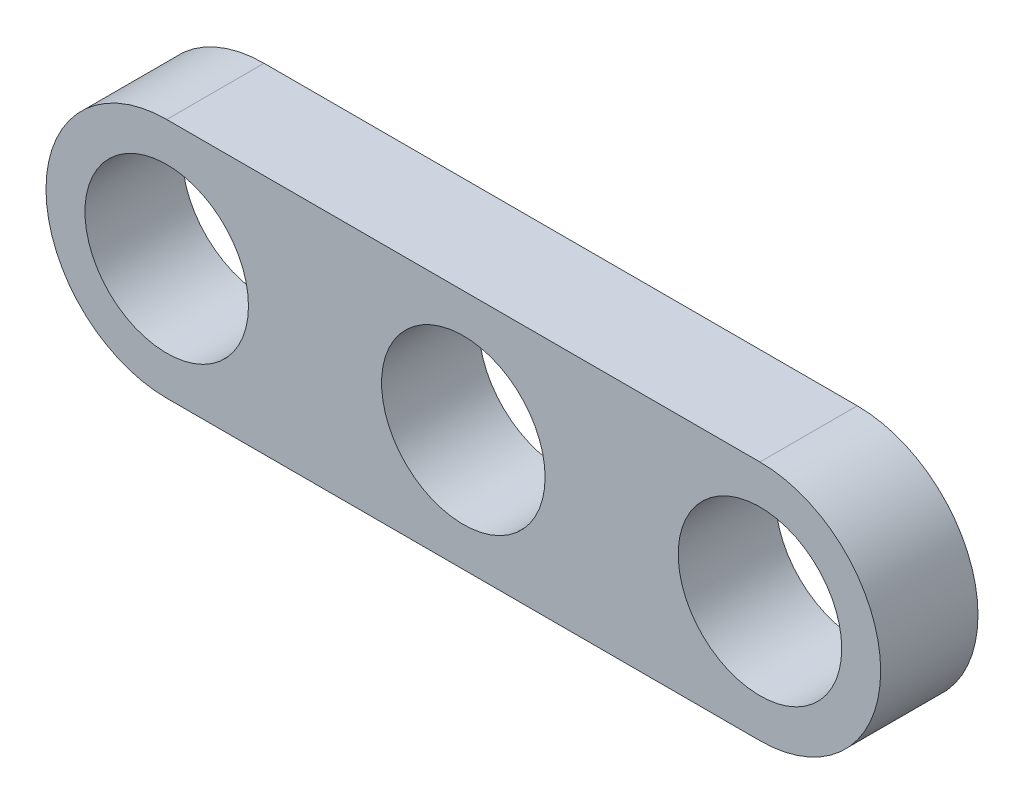
ISO-10303-21;
HEADER;
FILE_DESCRIPTION(('STEP AP214'),'2;1');
FILE_NAME('part.step','',(''),(''),'','','');
FILE_SCHEMA(('AUTOMOTIVE_DESIGN { 1 0 10303 214 1 1 1 1 }'));
ENDSEC;
DATA;
#1=APPLICATION_CONTEXT('core data for automotive mechanical design processes');
#2=APPLICATION_PROTOCOL_DEFINITION('international standard','automotive_design',2000,#1);
#3=PRODUCT_CONTEXT('',#1,'mechanical');
#4=PRODUCT('Part','Part','',(#3));
#5=PRODUCT_RELATED_PRODUCT_CATEGORY('part','',(#4));
#6=PRODUCT_DEFINITION_FORMATION('','',#4);
#7=PRODUCT_DEFINITION_CONTEXT('part definition',#1,'design');
#8=PRODUCT_DEFINITION('design','',#6,#7);
#9=PRODUCT_DEFINITION_SHAPE('','',#8);
#10=(LENGTH_UNIT() NAMED_UNIT(*) SI_UNIT(.MILLI.,.METRE.));
#11=(NAMED_UNIT(*) PLANE_ANGLE_UNIT() SI_UNIT($,.RADIAN.));
#12=(NAMED_UNIT(*) SI_UNIT($,.STERADIAN.) SOLID_ANGLE_UNIT());
#13=UNCERTAINTY_MEASURE_WITH_UNIT(LENGTH_MEASURE(1.E-05),#10,'distance_accuracy_value','');
#14=(GEOMETRIC_REPRESENTATION_CONTEXT(3) GLOBAL_UNCERTAINTY_ASSIGNED_CONTEXT((#13)) GLOBAL_UNIT_ASSIGNED_CONTEXT((#10,
#11,#12)) REPRESENTATION_CONTEXT('',''));
#15=CARTESIAN_POINT('',(0.,0.,0.));
#16=DIRECTION('',(0.,0.,1.));
#17=DIRECTION('',(1.,0.,0.));
#18=AXIS2_PLACEMENT_3D('',#15,#16,#17);
#19=CARTESIAN_POINT('',(-15.2370411810535,0.,5.));
#20=DIRECTION('',(0.,0.,1.));
#21=DIRECTION('',(1.,0.,0.));
#22=AXIS2_PLACEMENT_3D('',#19,#20,#21);
#23=PLANE('',#22);
#24=CARTESIAN_POINT('',(0.,0.,5.));
#25=DIRECTION('',(0.,0.,1.));
#26=DIRECTION('',(1.,0.,0.));
#27=AXIS2_PLACEMENT_3D('',#24,#25,#26);
#28=CIRCLE('',#27,4.20000000000003);
#29=CARTESIAN_POINT('',(4.20000000000002,0.,5.));
#30=VERTEX_POINT('',#29);
#31=EDGE_CURVE('E121',#30,#30,#28,.T.);
#32=ORIENTED_EDGE('',*,*,#31,.F.);
#33=EDGE_LOOP('',(#32));
#34=FACE_BOUND('',#33,.T.);
#35=CARTESIAN_POINT('',(-15.2370411810535,0.,5.));
#36=DIRECTION('',(0.,0.,1.));
#37=DIRECTION('',(1.,0.,0.));
#38=AXIS2_PLACEMENT_3D('',#35,#36,#37);
#39=CIRCLE('',#38,6.20000000000003);
#40=CARTESIAN_POINT('',(-15.2370411810535,6.20000000000003,5.));
#41=VERTEX_POINT('',#40);
#42=CARTESIAN_POINT('',(-15.2370411810535,-6.20000000000004,5.));
#43=VERTEX_POINT('',#42);
#44=EDGE_CURVE('E91',#41,#43,#39,.T.);
#45=ORIENTED_EDGE('',*,*,#44,.T.);
#46=DIRECTION('',(1.,0.,0.));
#47=VECTOR('',#46,1.);
#48=CARTESIAN_POINT('',(-15.2370411810535,-6.20000000000004,5.));
#49=LINE('',#48,#47);
#50=CARTESIAN_POINT('',(15.2370411810535,-6.20000000000002,5.));
#51=VERTEX_POINT('',#50);
#52=EDGE_CURVE('E86',#43,#51,#49,.T.);
#53=ORIENTED_EDGE('',*,*,#52,.T.);
#54=CARTESIAN_POINT('',(15.2370411810535,0.,5.));
#55=DIRECTION('',(0.,0.,1.));
#56=DIRECTION('',(1.,0.,0.));
#57=AXIS2_PLACEMENT_3D('',#54,#55,#56);
#58=CIRCLE('',#57,6.20000000000003);
#59=CARTESIAN_POINT('',(15.2370411810535,6.20000000000003,5.));
#60=VERTEX_POINT('',#59);
#61=EDGE_CURVE('E89',#51,#60,#58,.T.);
#62=ORIENTED_EDGE('',*,*,#61,.T.);
#63=DIRECTION('',(-1.,0.,0.));
#64=VECTOR('',#63,1.);
#65=CARTESIAN_POINT('',(-15.2370411810535,6.20000000000003,5.));
#66=LINE('',#65,#64);
#67=EDGE_CURVE('E56',#60,#41,#66,.T.);
#68=ORIENTED_EDGE('',*,*,#67,.T.);
#69=EDGE_LOOP('',(#45,#53,#62,#68));
#70=FACE_BOUND('',#69,.T.);
#71=CARTESIAN_POINT('',(-15.2370411810535,0.,5.));
#72=DIRECTION('',(0.,0.,1.));
#73=DIRECTION('',(1.,0.,0.));
#74=AXIS2_PLACEMENT_3D('',#71,#72,#73);
#75=CIRCLE('',#74,4.20000000000003);
#76=CARTESIAN_POINT('',(-11.0370411810535,0.,5.));
#77=VERTEX_POINT('',#76);
#78=EDGE_CURVE('E106',#77,#77,#75,.T.);
#79=ORIENTED_EDGE('',*,*,#78,.F.);
#80=EDGE_LOOP('',(#79));
#81=FACE_BOUND('',#80,.T.);
#82=CARTESIAN_POINT('',(15.2370411810535,0.,5.));
#83=DIRECTION('',(0.,0.,1.));
#84=DIRECTION('',(1.,0.,0.));
#85=AXIS2_PLACEMENT_3D('',#82,#83,#84);
#86=CIRCLE('',#85,4.20000000000002);
#87=CARTESIAN_POINT('',(19.4370411810535,0.,5.));
#88=VERTEX_POINT('',#87);
#89=EDGE_CURVE('E127',#88,#88,#86,.T.);
#90=ORIENTED_EDGE('',*,*,#89,.F.);
#91=EDGE_LOOP('',(#90));
#92=FACE_BOUND('',#91,.T.);
#93=ADVANCED_FACE('F39',(#34,#70,#81,#92),#23,.T.);
#94=CARTESIAN_POINT('',(-15.2370411810535,0.,0.));
#95=DIRECTION('',(0.,0.,1.));
#96=DIRECTION('',(1.,0.,0.));
#97=AXIS2_PLACEMENT_3D('',#94,#95,#96);
#98=PLANE('',#97);
#99=CARTESIAN_POINT('',(-15.2370411810535,0.,0.));
#100=DIRECTION('',(0.,0.,1.));
#101=DIRECTION('',(1.,0.,0.));
#102=AXIS2_PLACEMENT_3D('',#99,#100,#101);
#103=CIRCLE('',#102,6.20000000000003);
#104=CARTESIAN_POINT('',(-15.2370411810535,6.20000000000003,0.));
#105=VERTEX_POINT('',#104);
#106=CARTESIAN_POINT('',(-15.2370411810535,-6.20000000000004,0.));
#107=VERTEX_POINT('',#106);
#108=EDGE_CURVE('E103',#105,#107,#103,.T.);
#109=ORIENTED_EDGE('',*,*,#108,.F.);
#110=DIRECTION('',(-1.,0.,0.));
#111=VECTOR('',#110,1.);
#112=CARTESIAN_POINT('',(-15.2370411810535,6.20000000000003,0.));
#113=LINE('',#112,#111);
#114=CARTESIAN_POINT('',(15.2370411810535,6.20000000000003,0.));
#115=VERTEX_POINT('',#114);
#116=EDGE_CURVE('E79',#115,#105,#113,.T.);
#117=ORIENTED_EDGE('',*,*,#116,.F.);
#118=CARTESIAN_POINT('',(15.2370411810535,0.,0.));
#119=DIRECTION('',(0.,0.,1.));
#120=DIRECTION('',(1.,0.,0.));
#121=AXIS2_PLACEMENT_3D('',#118,#119,#120);
#122=CIRCLE('',#121,6.20000000000003);
#123=CARTESIAN_POINT('',(15.2370411810535,-6.20000000000002,0.));
#124=VERTEX_POINT('',#123);
#125=EDGE_CURVE('E73',#124,#115,#122,.T.);
#126=ORIENTED_EDGE('',*,*,#125,.F.);
#127=DIRECTION('',(1.,0.,0.));
#128=VECTOR('',#127,1.);
#129=CARTESIAN_POINT('',(-15.2370411810535,-6.20000000000004,0.));
#130=LINE('',#129,#128);
#131=EDGE_CURVE('E95',#107,#124,#130,.T.);
#132=ORIENTED_EDGE('',*,*,#131,.F.);
#133=EDGE_LOOP('',(#109,#117,#126,#132));
#134=FACE_BOUND('',#133,.T.);
#135=CARTESIAN_POINT('',(-15.2370411810535,0.,0.));
#136=DIRECTION('',(0.,0.,1.));
#137=DIRECTION('',(1.,0.,0.));
#138=AXIS2_PLACEMENT_3D('',#135,#136,#137);
#139=CIRCLE('',#138,4.20000000000003);
#140=CARTESIAN_POINT('',(-11.0370411810535,0.,0.));
#141=VERTEX_POINT('',#140);
#142=EDGE_CURVE('E118',#141,#141,#139,.T.);
#143=ORIENTED_EDGE('',*,*,#142,.T.);
#144=EDGE_LOOP('',(#143));
#145=FACE_BOUND('',#144,.T.);
#146=CARTESIAN_POINT('',(0.,0.,0.));
#147=DIRECTION('',(0.,0.,1.));
#148=DIRECTION('',(1.,0.,0.));
#149=AXIS2_PLACEMENT_3D('',#146,#147,#148);
#150=CIRCLE('',#149,4.20000000000003);
#151=CARTESIAN_POINT('',(4.20000000000002,0.,0.));
#152=VERTEX_POINT('',#151);
#153=EDGE_CURVE('E124',#152,#152,#150,.T.);
#154=ORIENTED_EDGE('',*,*,#153,.T.);
#155=EDGE_LOOP('',(#154));
#156=FACE_BOUND('',#155,.T.);
#157=CARTESIAN_POINT('',(15.2370411810535,0.,0.));
#158=DIRECTION('',(0.,0.,1.));
#159=DIRECTION('',(1.,0.,0.));
#160=AXIS2_PLACEMENT_3D('',#157,#158,#159);
#161=CIRCLE('',#160,4.20000000000002);
#162=CARTESIAN_POINT('',(19.4370411810535,0.,0.));
#163=VERTEX_POINT('',#162);
#164=EDGE_CURVE('E130',#163,#163,#161,.T.);
#165=ORIENTED_EDGE('',*,*,#164,.T.);
#166=EDGE_LOOP('',(#165));
#167=FACE_BOUND('',#166,.T.);
#168=ADVANCED_FACE('F114',(#134,#145,#156,#167),#98,.F.);
#169=CARTESIAN_POINT('',(-15.2370411810535,0.,5.));
#170=DIRECTION('',(0.,0.,-1.));
#171=DIRECTION('',(-1.,0.,0.));
#172=AXIS2_PLACEMENT_3D('',#169,#170,#171);
#173=CYLINDRICAL_SURFACE('',#172,6.20000000000003);
#174=ORIENTED_EDGE('',*,*,#108,.T.);
#175=DIRECTION('',(0.,0.,-1.));
#176=VECTOR('',#175,1.);
#177=CARTESIAN_POINT('',(-15.2370411810535,-6.20000000000004,5.));
#178=LINE('',#177,#176);
#179=EDGE_CURVE('E11',#43,#107,#178,.T.);
#180=ORIENTED_EDGE('',*,*,#179,.F.);
#181=ORIENTED_EDGE('',*,*,#44,.F.);
#182=DIRECTION('',(0.,0.,-1.));
#183=VECTOR('',#182,1.);
#184=CARTESIAN_POINT('',(-15.2370411810535,6.20000000000003,5.));
#185=LINE('',#184,#183);
#186=EDGE_CURVE('E99',#41,#105,#185,.T.);
#187=ORIENTED_EDGE('',*,*,#186,.T.);
#188=EDGE_LOOP('',(#174,#180,#181,#187));
#189=FACE_BOUND('',#188,.T.);
#190=ADVANCED_FACE('F41',(#189),#173,.T.);
#191=CARTESIAN_POINT('',(-15.2370411810535,-6.20000000000004,5.));
#192=DIRECTION('',(0.,1.,0.));
#193=DIRECTION('',(-1.,0.,0.));
#194=AXIS2_PLACEMENT_3D('',#191,#192,#193);
#195=PLANE('',#194);
#196=ORIENTED_EDGE('',*,*,#131,.T.);
#197=DIRECTION('',(0.,0.,-1.));
#198=VECTOR('',#197,1.);
#199=CARTESIAN_POINT('',(15.2370411810535,-6.20000000000002,5.));
#200=LINE('',#199,#198);
#201=EDGE_CURVE('E48',#51,#124,#200,.T.);
#202=ORIENTED_EDGE('',*,*,#201,.F.);
#203=ORIENTED_EDGE('',*,*,#52,.F.);
#204=ORIENTED_EDGE('',*,*,#179,.T.);
#205=EDGE_LOOP('',(#196,#202,#203,#204));
#206=FACE_BOUND('',#205,.T.);
#207=ADVANCED_FACE('F94',(#206),#195,.F.);
#208=CARTESIAN_POINT('',(15.2370411810535,0.,5.));
#209=DIRECTION('',(0.,0.,-1.));
#210=DIRECTION('',(-1.,0.,0.));
#211=AXIS2_PLACEMENT_3D('',#208,#209,#210);
#212=CYLINDRICAL_SURFACE('',#211,6.20000000000003);
#213=ORIENTED_EDGE('',*,*,#125,.T.);
#214=DIRECTION('',(0.,0.,-1.));
#215=VECTOR('',#214,1.);
#216=CARTESIAN_POINT('',(15.2370411810535,6.20000000000003,5.));
#217=LINE('',#216,#215);
#218=EDGE_CURVE('E96',#60,#115,#217,.T.);
#219=ORIENTED_EDGE('',*,*,#218,.F.);
#220=ORIENTED_EDGE('',*,*,#61,.F.);
#221=ORIENTED_EDGE('',*,*,#201,.T.);
#222=EDGE_LOOP('',(#213,#219,#220,#221));
#223=FACE_BOUND('',#222,.T.);
#224=ADVANCED_FACE('F97',(#223),#212,.T.);
#225=CARTESIAN_POINT('',(-15.2370411810535,6.20000000000003,5.));
#226=DIRECTION('',(0.,-1.,0.));
#227=DIRECTION('',(1.,0.,0.));
#228=AXIS2_PLACEMENT_3D('',#225,#226,#227);
#229=PLANE('',#228);
#230=ORIENTED_EDGE('',*,*,#116,.T.);
#231=ORIENTED_EDGE('',*,*,#186,.F.);
#232=ORIENTED_EDGE('',*,*,#67,.F.);
#233=ORIENTED_EDGE('',*,*,#218,.T.);
#234=EDGE_LOOP('',(#230,#231,#232,#233));
#235=FACE_BOUND('',#234,.T.);
#236=ADVANCED_FACE('F111',(#235),#229,.F.);
#237=CARTESIAN_POINT('',(-15.2370411810535,0.,5.));
#238=DIRECTION('',(0.,0.,-1.));
#239=DIRECTION('',(-1.,0.,0.));
#240=AXIS2_PLACEMENT_3D('',#237,#238,#239);
#241=CYLINDRICAL_SURFACE('',#240,4.20000000000003);
#242=ORIENTED_EDGE('',*,*,#78,.T.);
#243=EDGE_LOOP('',(#242));
#244=FACE_BOUND('',#243,.T.);
#245=ORIENTED_EDGE('',*,*,#142,.F.);
#246=EDGE_LOOP('',(#245));
#247=FACE_BOUND('',#246,.T.);
#248=ADVANCED_FACE('F148',(#244,#247),#241,.F.);
#249=CARTESIAN_POINT('',(0.,0.,5.));
#250=DIRECTION('',(0.,0.,-1.));
#251=DIRECTION('',(-1.,0.,0.));
#252=AXIS2_PLACEMENT_3D('',#249,#250,#251);
#253=CYLINDRICAL_SURFACE('',#252,4.20000000000003);
#254=ORIENTED_EDGE('',*,*,#31,.T.);
#255=EDGE_LOOP('',(#254));
#256=FACE_BOUND('',#255,.T.);
#257=ORIENTED_EDGE('',*,*,#153,.F.);
#258=EDGE_LOOP('',(#257));
#259=FACE_BOUND('',#258,.T.);
#260=ADVANCED_FACE('F193',(#256,#259),#253,.F.);
#261=CARTESIAN_POINT('',(15.2370411810535,0.,5.));
#262=DIRECTION('',(0.,0.,-1.));
#263=DIRECTION('',(-1.,0.,0.));
#264=AXIS2_PLACEMENT_3D('',#261,#262,#263);
#265=CYLINDRICAL_SURFACE('',#264,4.20000000000002);
#266=ORIENTED_EDGE('',*,*,#89,.T.);
#267=EDGE_LOOP('',(#266));
#268=FACE_BOUND('',#267,.T.);
#269=ORIENTED_EDGE('',*,*,#164,.F.);
#270=EDGE_LOOP('',(#269));
#271=FACE_BOUND('',#270,.T.);
#272=ADVANCED_FACE('F136',(#268,#271),#265,.F.);
#273=CLOSED_SHELL('',(#93,#168,#190,#207,#224,#236,#248,#260,#272));
#274=MANIFOLD_SOLID_BREP('B2',#273);
#275=ADVANCED_BREP_SHAPE_REPRESENTATION('',(#18,#274),#14);
#276=SHAPE_DEFINITION_REPRESENTATION(#9,#275);
ENDSEC;
END-ISO-10303-21;
